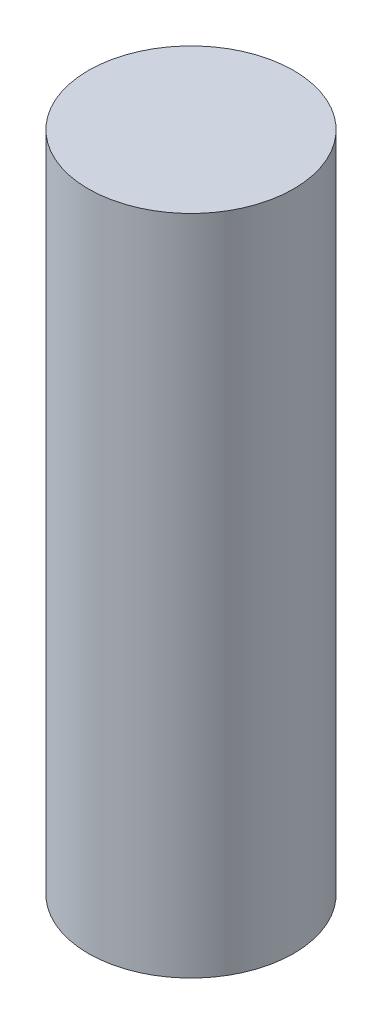
ISO-10303-21;
HEADER;
FILE_DESCRIPTION(('STEP AP214'),'2;1');
FILE_NAME('part.step','',(''),(''),'','','');
FILE_SCHEMA(('AUTOMOTIVE_DESIGN { 1 0 10303 214 1 1 1 1 }'));
ENDSEC;
DATA;
#1=APPLICATION_CONTEXT('core data for automotive mechanical design processes');
#2=APPLICATION_PROTOCOL_DEFINITION('international standard','automotive_design',2000,#1);
#3=PRODUCT_CONTEXT('',#1,'mechanical');
#4=PRODUCT('Part','Part','',(#3));
#5=PRODUCT_RELATED_PRODUCT_CATEGORY('part','',(#4));
#6=PRODUCT_DEFINITION_FORMATION('','',#4);
#7=PRODUCT_DEFINITION_CONTEXT('part definition',#1,'design');
#8=PRODUCT_DEFINITION('design','',#6,#7);
#9=PRODUCT_DEFINITION_SHAPE('','',#8);
#10=(LENGTH_UNIT() NAMED_UNIT(*) SI_UNIT(.MILLI.,.METRE.));
#11=(NAMED_UNIT(*) PLANE_ANGLE_UNIT() SI_UNIT($,.RADIAN.));
#12=(NAMED_UNIT(*) SI_UNIT($,.STERADIAN.) SOLID_ANGLE_UNIT());
#13=UNCERTAINTY_MEASURE_WITH_UNIT(LENGTH_MEASURE(1.E-05),#10,'distance_accuracy_value','');
#14=(GEOMETRIC_REPRESENTATION_CONTEXT(3) GLOBAL_UNCERTAINTY_ASSIGNED_CONTEXT((#13)) GLOBAL_UNIT_ASSIGNED_CONTEXT((#10,
#11,#12)) REPRESENTATION_CONTEXT('',''));
#15=CARTESIAN_POINT('',(0.,0.,0.));
#16=DIRECTION('',(0.,0.,1.));
#17=DIRECTION('',(1.,0.,0.));
#18=AXIS2_PLACEMENT_3D('',#15,#16,#17);
#19=CARTESIAN_POINT('',(0.,10.,0.));
#20=DIRECTION('',(0.,-1.,0.));
#21=DIRECTION('',(0.,0.,-1.));
#22=AXIS2_PLACEMENT_3D('',#19,#20,#21);
#23=CYLINDRICAL_SURFACE('',#22,1.55);
#24=CARTESIAN_POINT('',(0.,10.,0.));
#25=DIRECTION('',(0.,1.,0.));
#26=DIRECTION('',(0.,0.,1.));
#27=AXIS2_PLACEMENT_3D('',#24,#25,#26);
#28=CIRCLE('',#27,1.55);
#29=CARTESIAN_POINT('',(0.,10.,1.55));
#30=VERTEX_POINT('',#29);
#31=EDGE_CURVE('E10',#30,#30,#28,.T.);
#32=ORIENTED_EDGE('',*,*,#31,.F.);
#33=EDGE_LOOP('',(#32));
#34=FACE_BOUND('',#33,.T.);
#35=CARTESIAN_POINT('',(0.,0.,0.));
#36=DIRECTION('',(0.,1.,0.));
#37=DIRECTION('',(0.,0.,1.));
#38=AXIS2_PLACEMENT_3D('',#35,#36,#37);
#39=CIRCLE('',#38,1.55);
#40=CARTESIAN_POINT('',(0.,0.,1.55));
#41=VERTEX_POINT('',#40);
#42=EDGE_CURVE('E40',#41,#41,#39,.T.);
#43=ORIENTED_EDGE('',*,*,#42,.T.);
#44=EDGE_LOOP('',(#43));
#45=FACE_BOUND('',#44,.T.);
#46=ADVANCED_FACE('F37',(#34,#45),#23,.T.);
#47=CARTESIAN_POINT('',(0.,10.,0.));
#48=DIRECTION('',(0.,1.,0.));
#49=DIRECTION('',(0.,0.,1.));
#50=AXIS2_PLACEMENT_3D('',#47,#48,#49);
#51=PLANE('',#50);
#52=ORIENTED_EDGE('',*,*,#31,.T.);
#53=EDGE_LOOP('',(#52));
#54=FACE_BOUND('',#53,.T.);
#55=ADVANCED_FACE('F52',(#54),#51,.T.);
#56=CARTESIAN_POINT('',(0.,0.,0.));
#57=DIRECTION('',(0.,1.,0.));
#58=DIRECTION('',(0.,0.,1.));
#59=AXIS2_PLACEMENT_3D('',#56,#57,#58);
#60=PLANE('',#59);
#61=ORIENTED_EDGE('',*,*,#42,.F.);
#62=EDGE_LOOP('',(#61));
#63=FACE_BOUND('',#62,.T.);
#64=ADVANCED_FACE('F50',(#63),#60,.F.);
#65=CLOSED_SHELL('',(#46,#55,#64));
#66=MANIFOLD_SOLID_BREP('B2',#65);
#67=ADVANCED_BREP_SHAPE_REPRESENTATION('',(#18,#66),#14);
#68=SHAPE_DEFINITION_REPRESENTATION(#9,#67);
ENDSEC;
END-ISO-10303-21;
